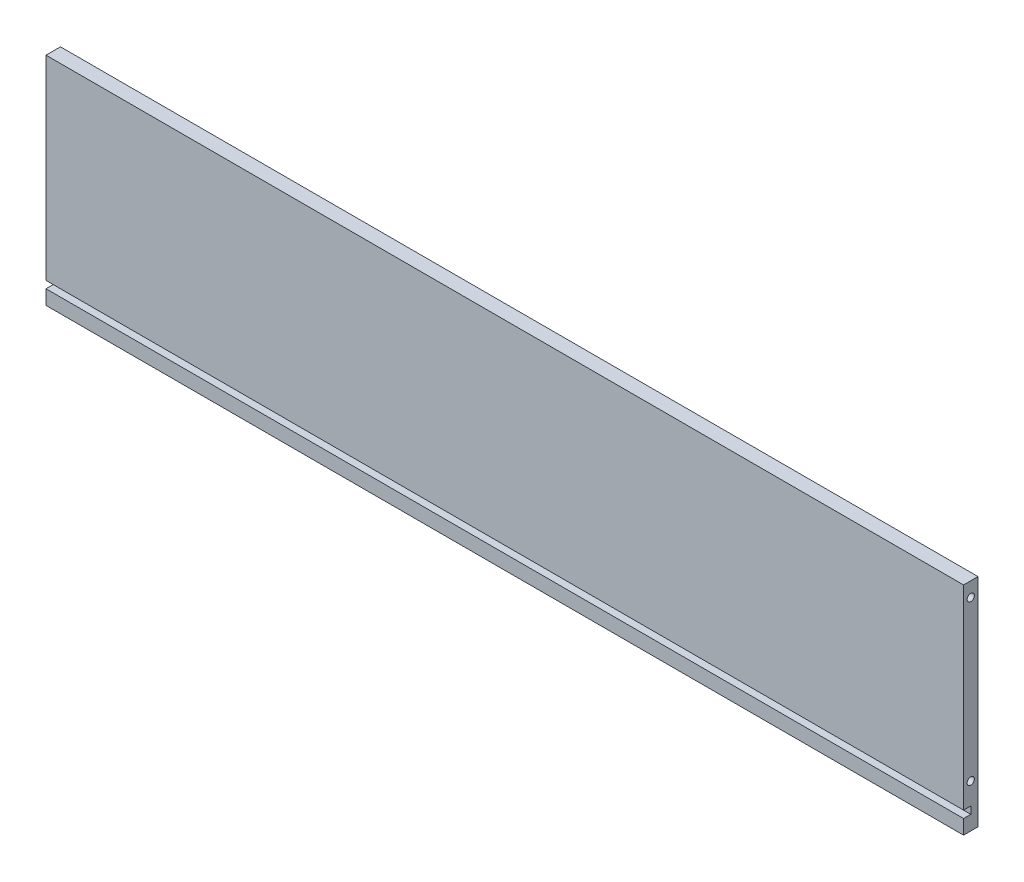
ISO-10303-21;
HEADER;
FILE_DESCRIPTION(('STEP AP214'),'2;1');
FILE_NAME('part.step','',(''),(''),'','','');
FILE_SCHEMA(('AUTOMOTIVE_DESIGN { 1 0 10303 214 1 1 1 1 }'));
ENDSEC;
DATA;
#1=APPLICATION_CONTEXT('core data for automotive mechanical design processes');
#2=APPLICATION_PROTOCOL_DEFINITION('international standard','automotive_design',2000,#1);
#3=PRODUCT_CONTEXT('',#1,'mechanical');
#4=PRODUCT('Part','Part','',(#3));
#5=PRODUCT_RELATED_PRODUCT_CATEGORY('part','',(#4));
#6=PRODUCT_DEFINITION_FORMATION('','',#4);
#7=PRODUCT_DEFINITION_CONTEXT('part definition',#1,'design');
#8=PRODUCT_DEFINITION('design','',#6,#7);
#9=PRODUCT_DEFINITION_SHAPE('','',#8);
#10=(LENGTH_UNIT() NAMED_UNIT(*) SI_UNIT(.MILLI.,.METRE.));
#11=(NAMED_UNIT(*) PLANE_ANGLE_UNIT() SI_UNIT($,.RADIAN.));
#12=(NAMED_UNIT(*) SI_UNIT($,.STERADIAN.) SOLID_ANGLE_UNIT());
#13=UNCERTAINTY_MEASURE_WITH_UNIT(LENGTH_MEASURE(1.E-05),#10,'distance_accuracy_value','');
#14=(GEOMETRIC_REPRESENTATION_CONTEXT(3) GLOBAL_UNCERTAINTY_ASSIGNED_CONTEXT((#13)) GLOBAL_UNIT_ASSIGNED_CONTEXT((#10,
#11,#12)) REPRESENTATION_CONTEXT('',''));
#15=CARTESIAN_POINT('',(0.,0.,0.));
#16=DIRECTION('',(0.,0.,1.));
#17=DIRECTION('',(1.,0.,0.));
#18=AXIS2_PLACEMENT_3D('',#15,#16,#17);
#19=CARTESIAN_POINT('',(-317.5,80.,10.));
#20=DIRECTION('',(0.,0.,-1.));
#21=DIRECTION('',(-1.,0.,0.));
#22=AXIS2_PLACEMENT_3D('',#19,#20,#21);
#23=PLANE('',#22);
#24=DIRECTION('',(0.,-1.,0.));
#25=VECTOR('',#24,1.);
#26=CARTESIAN_POINT('',(-317.5,-70.,10.));
#27=LINE('',#26,#25);
#28=CARTESIAN_POINT('',(-317.5,80.,10.));
#29=VERTEX_POINT('',#28);
#30=CARTESIAN_POINT('',(-317.5,-55.,10.));
#31=VERTEX_POINT('',#30);
#32=EDGE_CURVE('E176',#29,#31,#27,.T.);
#33=ORIENTED_EDGE('',*,*,#32,.T.);
#34=DIRECTION('',(1.,0.,0.));
#35=VECTOR('',#34,1.);
#36=CARTESIAN_POINT('',(-317.5,-55.,10.));
#37=LINE('',#36,#35);
#38=CARTESIAN_POINT('',(317.5,-55.,10.));
#39=VERTEX_POINT('',#38);
#40=EDGE_CURVE('E167',#31,#39,#37,.T.);
#41=ORIENTED_EDGE('',*,*,#40,.T.);
#42=DIRECTION('',(0.,1.,0.));
#43=VECTOR('',#42,1.);
#44=CARTESIAN_POINT('',(317.5,-70.,10.));
#45=LINE('',#44,#43);
#46=CARTESIAN_POINT('',(317.5,80.,10.));
#47=VERTEX_POINT('',#46);
#48=EDGE_CURVE('E180',#39,#47,#45,.T.);
#49=ORIENTED_EDGE('',*,*,#48,.T.);
#50=DIRECTION('',(-1.,0.,0.));
#51=VECTOR('',#50,1.);
#52=CARTESIAN_POINT('',(-317.5,80.,10.));
#53=LINE('',#52,#51);
#54=EDGE_CURVE('E58',#47,#29,#53,.T.);
#55=ORIENTED_EDGE('',*,*,#54,.T.);
#56=EDGE_LOOP('',(#33,#41,#49,#55));
#57=FACE_BOUND('',#56,.T.);
#58=ADVANCED_FACE('F34',(#57),#23,.F.);
#59=CARTESIAN_POINT('',(-317.5,-70.,10.));
#60=DIRECTION('',(1.,0.,0.));
#61=DIRECTION('',(0.,0.,-1.));
#62=AXIS2_PLACEMENT_3D('',#59,#60,#61);
#63=PLANE('',#62);
#64=CARTESIAN_POINT('',(-317.5,70.,4.99999999999999));
#65=DIRECTION('',(-1.,0.,0.));
#66=DIRECTION('',(0.,0.,1.));
#67=AXIS2_PLACEMENT_3D('',#64,#65,#66);
#68=CIRCLE('',#67,2.49999999999999);
#69=CARTESIAN_POINT('',(-317.5,70.,7.49999999999998));
#70=VERTEX_POINT('',#69);
#71=EDGE_CURVE('E128',#70,#70,#68,.T.);
#72=ORIENTED_EDGE('',*,*,#71,.F.);
#73=EDGE_LOOP('',(#72));
#74=FACE_BOUND('',#73,.T.);
#75=CARTESIAN_POINT('',(-317.5,-40.,4.99999999999998));
#76=DIRECTION('',(-1.,0.,0.));
#77=DIRECTION('',(0.,0.,1.));
#78=AXIS2_PLACEMENT_3D('',#75,#76,#77);
#79=CIRCLE('',#78,2.49999999999999);
#80=CARTESIAN_POINT('',(-317.5,-40.,7.49999999999997));
#81=VERTEX_POINT('',#80);
#82=EDGE_CURVE('E136',#81,#81,#79,.T.);
#83=ORIENTED_EDGE('',*,*,#82,.F.);
#84=EDGE_LOOP('',(#83));
#85=FACE_BOUND('',#84,.T.);
#86=DIRECTION('',(0.,1.,0.));
#87=VECTOR('',#86,1.);
#88=CARTESIAN_POINT('',(-317.5,-60.,5.));
#89=LINE('',#88,#87);
#90=CARTESIAN_POINT('',(-317.5,-60.,5.));
#91=VERTEX_POINT('',#90);
#92=CARTESIAN_POINT('',(-317.5,-55.,5.));
#93=VERTEX_POINT('',#92);
#94=EDGE_CURVE('E153',#91,#93,#89,.T.);
#95=ORIENTED_EDGE('',*,*,#94,.T.);
#96=DIRECTION('',(0.,0.,1.));
#97=VECTOR('',#96,1.);
#98=CARTESIAN_POINT('',(-317.5,-55.,10.));
#99=LINE('',#98,#97);
#100=EDGE_CURVE('E157',#93,#31,#99,.T.);
#101=ORIENTED_EDGE('',*,*,#100,.T.);
#102=ORIENTED_EDGE('',*,*,#32,.F.);
#103=DIRECTION('',(0.,0.,-1.));
#104=VECTOR('',#103,1.);
#105=CARTESIAN_POINT('',(-317.5,80.,10.));
#106=LINE('',#105,#104);
#107=CARTESIAN_POINT('',(-317.5,80.,0.));
#108=VERTEX_POINT('',#107);
#109=EDGE_CURVE('E185',#29,#108,#106,.T.);
#110=ORIENTED_EDGE('',*,*,#109,.T.);
#111=DIRECTION('',(0.,-1.,0.));
#112=VECTOR('',#111,1.);
#113=CARTESIAN_POINT('',(-317.5,-70.,0.));
#114=LINE('',#113,#112);
#115=CARTESIAN_POINT('',(-317.5,-70.,0.));
#116=VERTEX_POINT('',#115);
#117=EDGE_CURVE('E170',#108,#116,#114,.T.);
#118=ORIENTED_EDGE('',*,*,#117,.T.);
#119=DIRECTION('',(0.,0.,-1.));
#120=VECTOR('',#119,1.);
#121=CARTESIAN_POINT('',(-317.5,-70.,10.));
#122=LINE('',#121,#120);
#123=CARTESIAN_POINT('',(-317.5,-70.,10.));
#124=VERTEX_POINT('',#123);
#125=EDGE_CURVE('E11',#124,#116,#122,.T.);
#126=ORIENTED_EDGE('',*,*,#125,.F.);
#127=CARTESIAN_POINT('',(-317.5,-60.,10.));
#128=VERTEX_POINT('',#127);
#129=EDGE_CURVE('E86',#128,#124,#27,.T.);
#130=ORIENTED_EDGE('',*,*,#129,.F.);
#131=DIRECTION('',(0.,0.,-1.));
#132=VECTOR('',#131,1.);
#133=CARTESIAN_POINT('',(-317.5,-60.,10.));
#134=LINE('',#133,#132);
#135=EDGE_CURVE('E49',#128,#91,#134,.T.);
#136=ORIENTED_EDGE('',*,*,#135,.T.);
#137=EDGE_LOOP('',(#95,#101,#102,#110,#118,#126,#130,#136));
#138=FACE_BOUND('',#137,.T.);
#139=ADVANCED_FACE('F36',(#74,#85,#138),#63,.F.);
#140=CARTESIAN_POINT('',(-317.5,-70.,10.));
#141=DIRECTION('',(0.,1.,0.));
#142=DIRECTION('',(0.,0.,1.));
#143=AXIS2_PLACEMENT_3D('',#140,#141,#142);
#144=PLANE('',#143);
#145=DIRECTION('',(1.,0.,0.));
#146=VECTOR('',#145,1.);
#147=CARTESIAN_POINT('',(-317.5,-70.,0.));
#148=LINE('',#147,#146);
#149=CARTESIAN_POINT('',(317.5,-70.,0.));
#150=VERTEX_POINT('',#149);
#151=EDGE_CURVE('E188',#116,#150,#148,.T.);
#152=ORIENTED_EDGE('',*,*,#151,.T.);
#153=DIRECTION('',(0.,0.,-1.));
#154=VECTOR('',#153,1.);
#155=CARTESIAN_POINT('',(317.5,-70.,10.));
#156=LINE('',#155,#154);
#157=CARTESIAN_POINT('',(317.5,-70.,10.));
#158=VERTEX_POINT('',#157);
#159=EDGE_CURVE('E42',#158,#150,#156,.T.);
#160=ORIENTED_EDGE('',*,*,#159,.F.);
#161=DIRECTION('',(1.,0.,0.));
#162=VECTOR('',#161,1.);
#163=CARTESIAN_POINT('',(-317.5,-70.,10.));
#164=LINE('',#163,#162);
#165=EDGE_CURVE('E178',#124,#158,#164,.T.);
#166=ORIENTED_EDGE('',*,*,#165,.F.);
#167=ORIENTED_EDGE('',*,*,#125,.T.);
#168=EDGE_LOOP('',(#152,#160,#166,#167));
#169=FACE_BOUND('',#168,.T.);
#170=ADVANCED_FACE('F221',(#169),#144,.F.);
#171=CARTESIAN_POINT('',(317.5,-70.,10.));
#172=DIRECTION('',(-1.,0.,0.));
#173=DIRECTION('',(0.,0.,1.));
#174=AXIS2_PLACEMENT_3D('',#171,#172,#173);
#175=PLANE('',#174);
#176=CARTESIAN_POINT('',(317.5,70.,4.99999999999999));
#177=DIRECTION('',(1.,0.,0.));
#178=DIRECTION('',(0.,0.,-1.));
#179=AXIS2_PLACEMENT_3D('',#176,#177,#178);
#180=CIRCLE('',#179,2.49999999999999);
#181=CARTESIAN_POINT('',(317.5,70.,2.50000000000001));
#182=VERTEX_POINT('',#181);
#183=EDGE_CURVE('E142',#182,#182,#180,.T.);
#184=ORIENTED_EDGE('',*,*,#183,.F.);
#185=EDGE_LOOP('',(#184));
#186=FACE_BOUND('',#185,.T.);
#187=CARTESIAN_POINT('',(317.5,-40.,4.99999999999998));
#188=DIRECTION('',(1.,0.,0.));
#189=DIRECTION('',(0.,0.,-1.));
#190=AXIS2_PLACEMENT_3D('',#187,#188,#189);
#191=CIRCLE('',#190,2.49999999999999);
#192=CARTESIAN_POINT('',(317.5,-40.,2.49999999999999));
#193=VERTEX_POINT('',#192);
#194=EDGE_CURVE('E148',#193,#193,#191,.T.);
#195=ORIENTED_EDGE('',*,*,#194,.F.);
#196=EDGE_LOOP('',(#195));
#197=FACE_BOUND('',#196,.T.);
#198=ORIENTED_EDGE('',*,*,#48,.F.);
#199=DIRECTION('',(0.,0.,1.));
#200=VECTOR('',#199,1.);
#201=CARTESIAN_POINT('',(317.5,-55.,10.));
#202=LINE('',#201,#200);
#203=CARTESIAN_POINT('',(317.5,-55.,5.));
#204=VERTEX_POINT('',#203);
#205=EDGE_CURVE('E154',#204,#39,#202,.T.);
#206=ORIENTED_EDGE('',*,*,#205,.F.);
#207=DIRECTION('',(0.,1.,0.));
#208=VECTOR('',#207,1.);
#209=CARTESIAN_POINT('',(317.5,-60.,5.));
#210=LINE('',#209,#208);
#211=CARTESIAN_POINT('',(317.5,-60.,5.));
#212=VERTEX_POINT('',#211);
#213=EDGE_CURVE('E163',#212,#204,#210,.T.);
#214=ORIENTED_EDGE('',*,*,#213,.F.);
#215=DIRECTION('',(0.,0.,-1.));
#216=VECTOR('',#215,1.);
#217=CARTESIAN_POINT('',(317.5,-60.,10.));
#218=LINE('',#217,#216);
#219=CARTESIAN_POINT('',(317.5,-60.,10.));
#220=VERTEX_POINT('',#219);
#221=EDGE_CURVE('E151',#220,#212,#218,.T.);
#222=ORIENTED_EDGE('',*,*,#221,.F.);
#223=EDGE_CURVE('E181',#158,#220,#45,.T.);
#224=ORIENTED_EDGE('',*,*,#223,.F.);
#225=ORIENTED_EDGE('',*,*,#159,.T.);
#226=DIRECTION('',(0.,1.,0.));
#227=VECTOR('',#226,1.);
#228=CARTESIAN_POINT('',(317.5,-70.,0.));
#229=LINE('',#228,#227);
#230=CARTESIAN_POINT('',(317.5,80.,0.));
#231=VERTEX_POINT('',#230);
#232=EDGE_CURVE('E190',#150,#231,#229,.T.);
#233=ORIENTED_EDGE('',*,*,#232,.T.);
#234=DIRECTION('',(0.,0.,-1.));
#235=VECTOR('',#234,1.);
#236=CARTESIAN_POINT('',(317.5,80.,10.));
#237=LINE('',#236,#235);
#238=EDGE_CURVE('E194',#47,#231,#237,.T.);
#239=ORIENTED_EDGE('',*,*,#238,.F.);
#240=EDGE_LOOP('',(#198,#206,#214,#222,#224,#225,#233,#239));
#241=FACE_BOUND('',#240,.T.);
#242=ADVANCED_FACE('F201',(#186,#197,#241),#175,.F.);
#243=CARTESIAN_POINT('',(-317.5,80.,10.));
#244=DIRECTION('',(0.,-1.,0.));
#245=DIRECTION('',(0.,0.,-1.));
#246=AXIS2_PLACEMENT_3D('',#243,#244,#245);
#247=PLANE('',#246);
#248=DIRECTION('',(-1.,0.,0.));
#249=VECTOR('',#248,1.);
#250=CARTESIAN_POINT('',(-317.5,80.,0.));
#251=LINE('',#250,#249);
#252=EDGE_CURVE('E79',#231,#108,#251,.T.);
#253=ORIENTED_EDGE('',*,*,#252,.T.);
#254=ORIENTED_EDGE('',*,*,#109,.F.);
#255=ORIENTED_EDGE('',*,*,#54,.F.);
#256=ORIENTED_EDGE('',*,*,#238,.T.);
#257=EDGE_LOOP('',(#253,#254,#255,#256));
#258=FACE_BOUND('',#257,.T.);
#259=ADVANCED_FACE('F211',(#258),#247,.F.);
#260=ORIENTED_EDGE('',*,*,#223,.T.);
#261=DIRECTION('',(1.,0.,0.));
#262=VECTOR('',#261,1.);
#263=CARTESIAN_POINT('',(-317.5,-60.,10.));
#264=LINE('',#263,#262);
#265=EDGE_CURVE('E160',#128,#220,#264,.T.);
#266=ORIENTED_EDGE('',*,*,#265,.F.);
#267=ORIENTED_EDGE('',*,*,#129,.T.);
#268=ORIENTED_EDGE('',*,*,#165,.T.);
#269=EDGE_LOOP('',(#260,#266,#267,#268));
#270=FACE_BOUND('',#269,.T.);
#271=ADVANCED_FACE('F220',(#270),#23,.F.);
#272=CARTESIAN_POINT('',(-317.5,80.,0.));
#273=DIRECTION('',(0.,0.,-1.));
#274=DIRECTION('',(-1.,0.,0.));
#275=AXIS2_PLACEMENT_3D('',#272,#273,#274);
#276=PLANE('',#275);
#277=ORIENTED_EDGE('',*,*,#117,.F.);
#278=ORIENTED_EDGE('',*,*,#252,.F.);
#279=ORIENTED_EDGE('',*,*,#232,.F.);
#280=ORIENTED_EDGE('',*,*,#151,.F.);
#281=EDGE_LOOP('',(#277,#278,#279,#280));
#282=FACE_BOUND('',#281,.T.);
#283=ADVANCED_FACE('F207',(#282),#276,.T.);
#284=CARTESIAN_POINT('',(-317.5,-55.,10.));
#285=DIRECTION('',(0.,1.,0.));
#286=DIRECTION('',(0.,0.,1.));
#287=AXIS2_PLACEMENT_3D('',#284,#285,#286);
#288=PLANE('',#287);
#289=ORIENTED_EDGE('',*,*,#205,.T.);
#290=ORIENTED_EDGE('',*,*,#40,.F.);
#291=ORIENTED_EDGE('',*,*,#100,.F.);
#292=DIRECTION('',(1.,0.,0.));
#293=VECTOR('',#292,1.);
#294=CARTESIAN_POINT('',(-317.5,-55.,5.));
#295=LINE('',#294,#293);
#296=EDGE_CURVE('E171',#93,#204,#295,.T.);
#297=ORIENTED_EDGE('',*,*,#296,.T.);
#298=EDGE_LOOP('',(#289,#290,#291,#297));
#299=FACE_BOUND('',#298,.T.);
#300=ADVANCED_FACE('F216',(#299),#288,.F.);
#301=CARTESIAN_POINT('',(-317.5,-60.,5.));
#302=DIRECTION('',(0.,0.,-1.));
#303=DIRECTION('',(-1.,0.,0.));
#304=AXIS2_PLACEMENT_3D('',#301,#302,#303);
#305=PLANE('',#304);
#306=ORIENTED_EDGE('',*,*,#213,.T.);
#307=ORIENTED_EDGE('',*,*,#296,.F.);
#308=ORIENTED_EDGE('',*,*,#94,.F.);
#309=DIRECTION('',(1.,0.,0.));
#310=VECTOR('',#309,1.);
#311=CARTESIAN_POINT('',(-317.5,-60.,5.));
#312=LINE('',#311,#310);
#313=EDGE_CURVE('E173',#91,#212,#312,.T.);
#314=ORIENTED_EDGE('',*,*,#313,.T.);
#315=EDGE_LOOP('',(#306,#307,#308,#314));
#316=FACE_BOUND('',#315,.T.);
#317=ADVANCED_FACE('F219',(#316),#305,.F.);
#318=CARTESIAN_POINT('',(-317.5,-60.,10.));
#319=DIRECTION('',(0.,-1.,0.));
#320=DIRECTION('',(0.,0.,-1.));
#321=AXIS2_PLACEMENT_3D('',#318,#319,#320);
#322=PLANE('',#321);
#323=ORIENTED_EDGE('',*,*,#221,.T.);
#324=ORIENTED_EDGE('',*,*,#313,.F.);
#325=ORIENTED_EDGE('',*,*,#135,.F.);
#326=ORIENTED_EDGE('',*,*,#265,.T.);
#327=EDGE_LOOP('',(#323,#324,#325,#326));
#328=FACE_BOUND('',#327,.T.);
#329=ADVANCED_FACE('F256',(#328),#322,.F.);
#330=CARTESIAN_POINT('',(317.5,-40.,4.99999999999998));
#331=DIRECTION('',(1.,0.,0.));
#332=DIRECTION('',(0.,0.,-1.));
#333=AXIS2_PLACEMENT_3D('',#330,#331,#332);
#334=CYLINDRICAL_SURFACE('',#333,2.49999999999999);
#335=CARTESIAN_POINT('',(302.5,-40.,4.99999999999998));
#336=DIRECTION('',(1.,0.,0.));
#337=DIRECTION('',(0.,0.,-1.));
#338=AXIS2_PLACEMENT_3D('',#335,#336,#337);
#339=CIRCLE('',#338,2.5);
#340=CARTESIAN_POINT('',(302.5,-40.,2.49999999999998));
#341=VERTEX_POINT('',#340);
#342=EDGE_CURVE('E145',#341,#341,#339,.T.);
#343=ORIENTED_EDGE('',*,*,#342,.F.);
#344=EDGE_LOOP('',(#343));
#345=FACE_BOUND('',#344,.T.);
#346=ORIENTED_EDGE('',*,*,#194,.T.);
#347=EDGE_LOOP('',(#346));
#348=FACE_BOUND('',#347,.T.);
#349=ADVANCED_FACE('F261',(#345,#348),#334,.F.);
#350=CARTESIAN_POINT('',(302.5,-40.,4.99999999999998));
#351=DIRECTION('',(1.,0.,0.));
#352=DIRECTION('',(0.,0.,-1.));
#353=AXIS2_PLACEMENT_3D('',#350,#351,#352);
#354=CONICAL_SURFACE('',#353,2.5,1.02974425867666);
#355=CARTESIAN_POINT('',(300.997848452431,-40.,4.99999999999998));
#356=VERTEX_POINT('',#355);
#357=VERTEX_LOOP('',#356);
#358=FACE_BOUND('',#357,.T.);
#359=ORIENTED_EDGE('',*,*,#342,.T.);
#360=EDGE_LOOP('',(#359));
#361=FACE_BOUND('',#360,.T.);
#362=ADVANCED_FACE('F266',(#358,#361),#354,.F.);
#363=CARTESIAN_POINT('',(317.5,70.,4.99999999999999));
#364=DIRECTION('',(1.,0.,0.));
#365=DIRECTION('',(0.,0.,-1.));
#366=AXIS2_PLACEMENT_3D('',#363,#364,#365);
#367=CYLINDRICAL_SURFACE('',#366,2.5);
#368=CARTESIAN_POINT('',(302.5,70.,4.99999999999999));
#369=DIRECTION('',(1.,0.,0.));
#370=DIRECTION('',(0.,0.,-1.));
#371=AXIS2_PLACEMENT_3D('',#368,#369,#370);
#372=CIRCLE('',#371,2.5);
#373=CARTESIAN_POINT('',(302.5,70.,2.49999999999999));
#374=VERTEX_POINT('',#373);
#375=EDGE_CURVE('E139',#374,#374,#372,.T.);
#376=ORIENTED_EDGE('',*,*,#375,.F.);
#377=EDGE_LOOP('',(#376));
#378=FACE_BOUND('',#377,.T.);
#379=ORIENTED_EDGE('',*,*,#183,.T.);
#380=EDGE_LOOP('',(#379));
#381=FACE_BOUND('',#380,.T.);
#382=ADVANCED_FACE('F276',(#378,#381),#367,.F.);
#383=CARTESIAN_POINT('',(302.5,70.,4.99999999999999));
#384=DIRECTION('',(1.,0.,0.));
#385=DIRECTION('',(0.,0.,-1.));
#386=AXIS2_PLACEMENT_3D('',#383,#384,#385);
#387=CONICAL_SURFACE('',#386,2.5,1.02974425867666);
#388=CARTESIAN_POINT('',(300.997848452431,70.,4.99999999999999));
#389=VERTEX_POINT('',#388);
#390=VERTEX_LOOP('',#389);
#391=FACE_BOUND('',#390,.T.);
#392=ORIENTED_EDGE('',*,*,#375,.T.);
#393=EDGE_LOOP('',(#392));
#394=FACE_BOUND('',#393,.T.);
#395=ADVANCED_FACE('F286',(#391,#394),#387,.F.);
#396=CARTESIAN_POINT('',(-317.5,-40.,4.99999999999998));
#397=DIRECTION('',(-1.,0.,0.));
#398=DIRECTION('',(0.,0.,1.));
#399=AXIS2_PLACEMENT_3D('',#396,#397,#398);
#400=CYLINDRICAL_SURFACE('',#399,2.49999999999999);
#401=CARTESIAN_POINT('',(-302.5,-40.,4.99999999999998));
#402=DIRECTION('',(-1.,0.,0.));
#403=DIRECTION('',(0.,0.,1.));
#404=AXIS2_PLACEMENT_3D('',#401,#402,#403);
#405=CIRCLE('',#404,2.5);
#406=CARTESIAN_POINT('',(-302.5,-40.,7.49999999999997));
#407=VERTEX_POINT('',#406);
#408=EDGE_CURVE('E131',#407,#407,#405,.T.);
#409=ORIENTED_EDGE('',*,*,#408,.F.);
#410=EDGE_LOOP('',(#409));
#411=FACE_BOUND('',#410,.T.);
#412=ORIENTED_EDGE('',*,*,#82,.T.);
#413=EDGE_LOOP('',(#412));
#414=FACE_BOUND('',#413,.T.);
#415=ADVANCED_FACE('F296',(#411,#414),#400,.F.);
#416=CARTESIAN_POINT('',(-302.5,-40.,4.99999999999998));
#417=DIRECTION('',(-1.,0.,0.));
#418=DIRECTION('',(0.,0.,1.));
#419=AXIS2_PLACEMENT_3D('',#416,#417,#418);
#420=CONICAL_SURFACE('',#419,2.5,1.02974425867666);
#421=CARTESIAN_POINT('',(-300.997848452431,-40.,4.99999999999998));
#422=VERTEX_POINT('',#421);
#423=VERTEX_LOOP('',#422);
#424=FACE_BOUND('',#423,.T.);
#425=ORIENTED_EDGE('',*,*,#408,.T.);
#426=EDGE_LOOP('',(#425));
#427=FACE_BOUND('',#426,.T.);
#428=ADVANCED_FACE('F312',(#424,#427),#420,.F.);
#429=CARTESIAN_POINT('',(-317.5,70.,4.99999999999999));
#430=DIRECTION('',(-1.,0.,0.));
#431=DIRECTION('',(0.,0.,1.));
#432=AXIS2_PLACEMENT_3D('',#429,#430,#431);
#433=CYLINDRICAL_SURFACE('',#432,2.5);
#434=CARTESIAN_POINT('',(-302.5,70.,4.99999999999999));
#435=DIRECTION('',(-1.,0.,0.));
#436=DIRECTION('',(0.,0.,1.));
#437=AXIS2_PLACEMENT_3D('',#434,#435,#436);
#438=CIRCLE('',#437,2.5);
#439=CARTESIAN_POINT('',(-302.5,70.,7.5));
#440=VERTEX_POINT('',#439);
#441=EDGE_CURVE('E126',#440,#440,#438,.T.);
#442=ORIENTED_EDGE('',*,*,#441,.F.);
#443=EDGE_LOOP('',(#442));
#444=FACE_BOUND('',#443,.T.);
#445=ORIENTED_EDGE('',*,*,#71,.T.);
#446=EDGE_LOOP('',(#445));
#447=FACE_BOUND('',#446,.T.);
#448=ADVANCED_FACE('F122',(#444,#447),#433,.F.);
#449=CARTESIAN_POINT('',(-302.5,70.,4.99999999999999));
#450=DIRECTION('',(-1.,0.,0.));
#451=DIRECTION('',(0.,0.,1.));
#452=AXIS2_PLACEMENT_3D('',#449,#450,#451);
#453=CONICAL_SURFACE('',#452,2.5,1.02974425867666);
#454=CARTESIAN_POINT('',(-300.997848452431,70.,4.99999999999999));
#455=VERTEX_POINT('',#454);
#456=VERTEX_LOOP('',#455);
#457=FACE_BOUND('',#456,.T.);
#458=ORIENTED_EDGE('',*,*,#441,.T.);
#459=EDGE_LOOP('',(#458));
#460=FACE_BOUND('',#459,.T.);
#461=ADVANCED_FACE('F119',(#457,#460),#453,.F.);
#462=CLOSED_SHELL('',(#58,#139,#170,#242,#259,#271,#283,#300,#317,#329,#349,#362,#382,#395,#415,
#428,#448,#461));
#463=MANIFOLD_SOLID_BREP('B2',#462);
#464=ADVANCED_BREP_SHAPE_REPRESENTATION('',(#18,#463),#14);
#465=SHAPE_DEFINITION_REPRESENTATION(#9,#464);
ENDSEC;
END-ISO-10303-21;
